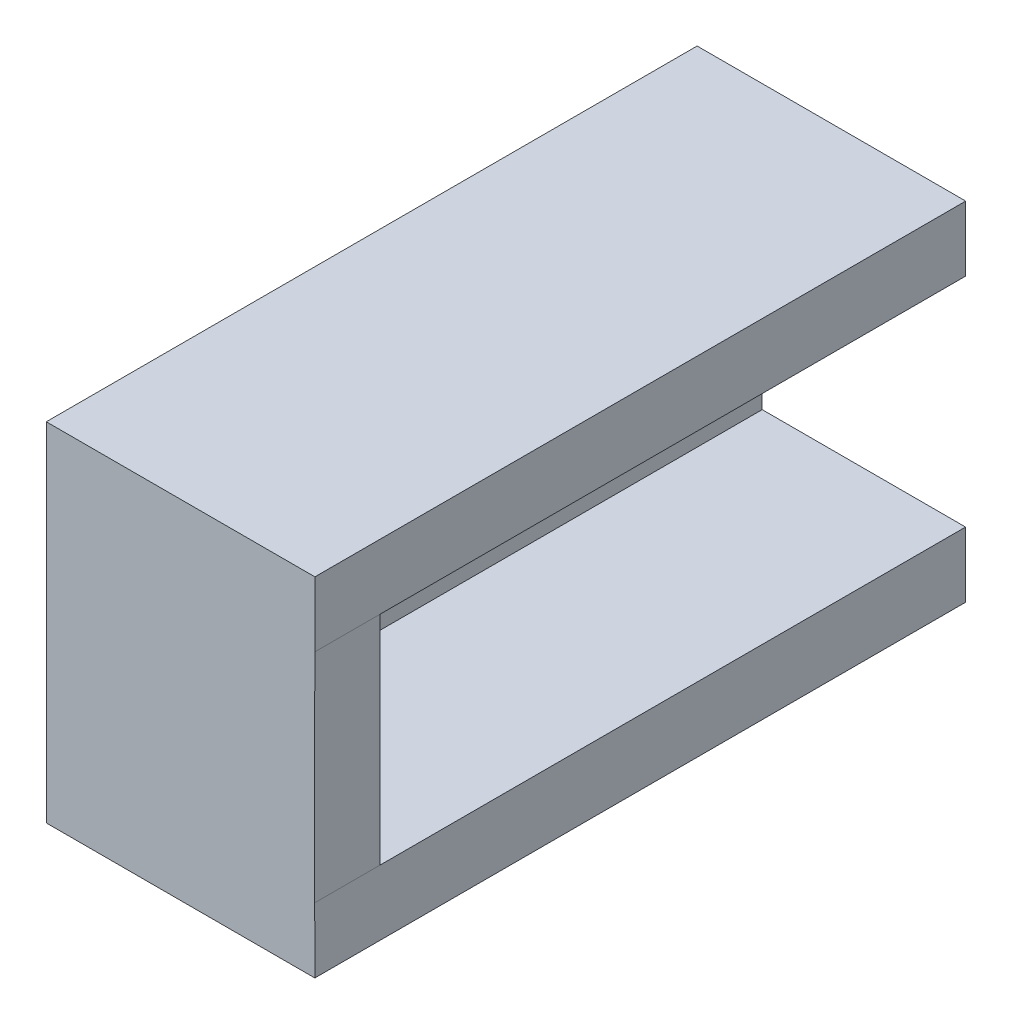
ISO-10303-21;
HEADER;
FILE_DESCRIPTION(('STEP AP214'),'2;1');
FILE_NAME('part.step','',(''),(''),'','','');
FILE_SCHEMA(('AUTOMOTIVE_DESIGN { 1 0 10303 214 1 1 1 1 }'));
ENDSEC;
DATA;
#1=APPLICATION_CONTEXT('core data for automotive mechanical design processes');
#2=APPLICATION_PROTOCOL_DEFINITION('international standard','automotive_design',2000,#1);
#3=PRODUCT_CONTEXT('',#1,'mechanical');
#4=PRODUCT('Part','Part','',(#3));
#5=PRODUCT_RELATED_PRODUCT_CATEGORY('part','',(#4));
#6=PRODUCT_DEFINITION_FORMATION('','',#4);
#7=PRODUCT_DEFINITION_CONTEXT('part definition',#1,'design');
#8=PRODUCT_DEFINITION('design','',#6,#7);
#9=PRODUCT_DEFINITION_SHAPE('','',#8);
#10=(LENGTH_UNIT() NAMED_UNIT(*) SI_UNIT(.MILLI.,.METRE.));
#11=(NAMED_UNIT(*) PLANE_ANGLE_UNIT() SI_UNIT($,.RADIAN.));
#12=(NAMED_UNIT(*) SI_UNIT($,.STERADIAN.) SOLID_ANGLE_UNIT());
#13=UNCERTAINTY_MEASURE_WITH_UNIT(LENGTH_MEASURE(1.E-05),#10,'distance_accuracy_value','');
#14=(GEOMETRIC_REPRESENTATION_CONTEXT(3) GLOBAL_UNCERTAINTY_ASSIGNED_CONTEXT((#13)) GLOBAL_UNIT_ASSIGNED_CONTEXT((#10,
#11,#12)) REPRESENTATION_CONTEXT('',''));
#15=CARTESIAN_POINT('',(0.,0.,0.));
#16=DIRECTION('',(0.,0.,1.));
#17=DIRECTION('',(1.,0.,0.));
#18=AXIS2_PLACEMENT_3D('',#15,#16,#17);
#19=CARTESIAN_POINT('',(0.,-90.9796047629119,-228.6));
#20=DIRECTION('',(0.,1.,0.));
#21=DIRECTION('',(0.,0.,1.));
#22=AXIS2_PLACEMENT_3D('',#19,#20,#21);
#23=PLANE('',#22);
#24=DIRECTION('',(-1.,0.,0.));
#25=VECTOR('',#24,1.);
#26=CARTESIAN_POINT('',(0.,-90.9796047629119,0.));
#27=LINE('',#26,#25);
#28=CARTESIAN_POINT('',(-1393.79066229486,-90.9796047629119,0.));
#29=VERTEX_POINT('',#28);
#30=CARTESIAN_POINT('',(-1473.16566229486,-90.9796047629119,0.));
#31=VERTEX_POINT('',#30);
#32=EDGE_CURVE('E67',#29,#31,#27,.T.);
#33=ORIENTED_EDGE('',*,*,#32,.T.);
#34=DIRECTION('',(0.,0.,1.));
#35=VECTOR('',#34,1.);
#36=CARTESIAN_POINT('',(-1473.16566229486,-90.9796047629119,-228.6));
#37=LINE('',#36,#35);
#38=CARTESIAN_POINT('',(-1473.16566229486,-90.9796047629119,-228.6));
#39=VERTEX_POINT('',#38);
#40=EDGE_CURVE('E181',#39,#31,#37,.T.);
#41=ORIENTED_EDGE('',*,*,#40,.F.);
#42=DIRECTION('',(-1.,0.,0.));
#43=VECTOR('',#42,1.);
#44=CARTESIAN_POINT('',(0.,-90.9796047629119,-228.6));
#45=LINE('',#44,#43);
#46=CARTESIAN_POINT('',(-1393.79066229486,-90.9796047629119,-228.6));
#47=VERTEX_POINT('',#46);
#48=EDGE_CURVE('E171',#47,#39,#45,.T.);
#49=ORIENTED_EDGE('',*,*,#48,.F.);
#50=DIRECTION('',(0.,0.,1.));
#51=VECTOR('',#50,1.);
#52=CARTESIAN_POINT('',(-1393.79066229486,-90.9796047629119,-228.6));
#53=LINE('',#52,#51);
#54=EDGE_CURVE('E179',#47,#29,#53,.T.);
#55=ORIENTED_EDGE('',*,*,#54,.T.);
#56=EDGE_LOOP('',(#33,#41,#49,#55));
#57=FACE_BOUND('',#56,.T.);
#58=ADVANCED_FACE('F43',(#57),#23,.F.);
#59=CARTESIAN_POINT('',(-1473.16566229486,0.,-228.6));
#60=DIRECTION('',(-1.,0.,0.));
#61=DIRECTION('',(0.,0.,1.));
#62=AXIS2_PLACEMENT_3D('',#59,#60,#61);
#63=PLANE('',#62);
#64=DIRECTION('',(0.,-1.,0.));
#65=VECTOR('',#64,1.);
#66=CARTESIAN_POINT('',(-1473.16566229486,0.,0.));
#67=LINE('',#66,#65);
#68=CARTESIAN_POINT('',(-1473.16566229486,-175.779604762912,0.));
#69=VERTEX_POINT('',#68);
#70=EDGE_CURVE('E145',#31,#69,#67,.T.);
#71=ORIENTED_EDGE('',*,*,#70,.T.);
#72=DIRECTION('',(0.,0.,1.));
#73=VECTOR('',#72,1.);
#74=CARTESIAN_POINT('',(-1473.16566229486,-175.779604762912,-228.6));
#75=LINE('',#74,#73);
#76=CARTESIAN_POINT('',(-1473.16566229486,-175.779604762912,-228.6));
#77=VERTEX_POINT('',#76);
#78=EDGE_CURVE('E183',#77,#69,#75,.T.);
#79=ORIENTED_EDGE('',*,*,#78,.F.);
#80=DIRECTION('',(0.,-1.,0.));
#81=VECTOR('',#80,1.);
#82=CARTESIAN_POINT('',(-1473.16566229486,0.,-228.6));
#83=LINE('',#82,#81);
#84=EDGE_CURVE('E169',#39,#77,#83,.T.);
#85=ORIENTED_EDGE('',*,*,#84,.F.);
#86=ORIENTED_EDGE('',*,*,#40,.T.);
#87=EDGE_LOOP('',(#71,#79,#85,#86));
#88=FACE_BOUND('',#87,.T.);
#89=ADVANCED_FACE('F207',(#88),#63,.F.);
#90=CARTESIAN_POINT('',(0.,-175.779604762912,-228.6));
#91=DIRECTION('',(0.,-1.,0.));
#92=DIRECTION('',(0.,0.,-1.));
#93=AXIS2_PLACEMENT_3D('',#90,#91,#92);
#94=PLANE('',#93);
#95=DIRECTION('',(1.,0.,0.));
#96=VECTOR('',#95,1.);
#97=CARTESIAN_POINT('',(0.,-175.779604762912,0.));
#98=LINE('',#97,#96);
#99=CARTESIAN_POINT('',(-1393.80082229486,-175.779604762912,0.));
#100=VERTEX_POINT('',#99);
#101=EDGE_CURVE('E143',#69,#100,#98,.T.);
#102=ORIENTED_EDGE('',*,*,#101,.T.);
#103=DIRECTION('',(0.,0.,1.));
#104=VECTOR('',#103,1.);
#105=CARTESIAN_POINT('',(-1393.80082229486,-175.779604762912,-228.6));
#106=LINE('',#105,#104);
#107=CARTESIAN_POINT('',(-1393.80082229486,-175.779604762912,-228.6));
#108=VERTEX_POINT('',#107);
#109=EDGE_CURVE('E137',#108,#100,#106,.T.);
#110=ORIENTED_EDGE('',*,*,#109,.F.);
#111=DIRECTION('',(1.,0.,0.));
#112=VECTOR('',#111,1.);
#113=CARTESIAN_POINT('',(0.,-175.779604762912,-228.6));
#114=LINE('',#113,#112);
#115=EDGE_CURVE('E167',#77,#108,#114,.T.);
#116=ORIENTED_EDGE('',*,*,#115,.F.);
#117=ORIENTED_EDGE('',*,*,#78,.T.);
#118=EDGE_LOOP('',(#102,#110,#116,#117));
#119=FACE_BOUND('',#118,.T.);
#120=ADVANCED_FACE('F212',(#119),#94,.F.);
#121=CARTESIAN_POINT('',(-1498.56566229486,0.,-228.6));
#122=DIRECTION('',(-1.,0.,0.));
#123=DIRECTION('',(0.,0.,1.));
#124=AXIS2_PLACEMENT_3D('',#121,#122,#123);
#125=PLANE('',#124);
#126=DIRECTION('',(0.,0.,1.));
#127=VECTOR('',#126,1.);
#128=CARTESIAN_POINT('',(-1498.56566229486,-201.179604762912,-228.6));
#129=LINE('',#128,#127);
#130=CARTESIAN_POINT('',(-1498.56566229486,-201.179604762912,-228.6));
#131=VERTEX_POINT('',#130);
#132=CARTESIAN_POINT('',(-1498.56566229486,-201.179604762912,25.4));
#133=VERTEX_POINT('',#132);
#134=EDGE_CURVE('E47',#131,#133,#129,.T.);
#135=ORIENTED_EDGE('',*,*,#134,.T.);
#136=DIRECTION('',(0.,-1.,0.));
#137=VECTOR('',#136,1.);
#138=CARTESIAN_POINT('',(-1498.56566229486,0.,25.4));
#139=LINE('',#138,#137);
#140=CARTESIAN_POINT('',(-1498.56566229486,-65.5796047629119,25.4));
#141=VERTEX_POINT('',#140);
#142=EDGE_CURVE('E153',#141,#133,#139,.T.);
#143=ORIENTED_EDGE('',*,*,#142,.F.);
#144=DIRECTION('',(0.,0.,1.));
#145=VECTOR('',#144,1.);
#146=CARTESIAN_POINT('',(-1498.56566229486,-65.5796047629119,-228.6));
#147=LINE('',#146,#145);
#148=CARTESIAN_POINT('',(-1498.56566229486,-65.5796047629119,-228.6));
#149=VERTEX_POINT('',#148);
#150=EDGE_CURVE('E11',#149,#141,#147,.T.);
#151=ORIENTED_EDGE('',*,*,#150,.F.);
#152=DIRECTION('',(0.,-1.,0.));
#153=VECTOR('',#152,1.);
#154=CARTESIAN_POINT('',(-1498.56566229486,0.,-228.6));
#155=LINE('',#154,#153);
#156=EDGE_CURVE('E160',#149,#131,#155,.T.);
#157=ORIENTED_EDGE('',*,*,#156,.T.);
#158=EDGE_LOOP('',(#135,#143,#151,#157));
#159=FACE_BOUND('',#158,.T.);
#160=ADVANCED_FACE('F45',(#159),#125,.T.);
#161=CARTESIAN_POINT('',(0.,-65.5796047629119,-228.6));
#162=DIRECTION('',(0.,1.,0.));
#163=DIRECTION('',(0.,0.,1.));
#164=AXIS2_PLACEMENT_3D('',#161,#162,#163);
#165=PLANE('',#164);
#166=ORIENTED_EDGE('',*,*,#150,.T.);
#167=DIRECTION('',(-1.,0.,0.));
#168=VECTOR('',#167,1.);
#169=CARTESIAN_POINT('',(0.,-65.5796047629119,25.4));
#170=LINE('',#169,#168);
#171=CARTESIAN_POINT('',(-1393.74098229486,-65.5796047629119,25.4));
#172=VERTEX_POINT('',#171);
#173=EDGE_CURVE('E157',#172,#141,#170,.T.);
#174=ORIENTED_EDGE('',*,*,#173,.F.);
#175=DIRECTION('',(0.,0.,1.));
#176=VECTOR('',#175,1.);
#177=CARTESIAN_POINT('',(-1393.74098229486,-65.5796047629119,-228.6));
#178=LINE('',#177,#176);
#179=CARTESIAN_POINT('',(-1393.74098229486,-65.5796047629119,-228.6));
#180=VERTEX_POINT('',#179);
#181=EDGE_CURVE('E52',#180,#172,#178,.T.);
#182=ORIENTED_EDGE('',*,*,#181,.F.);
#183=DIRECTION('',(-1.,0.,0.));
#184=VECTOR('',#183,1.);
#185=CARTESIAN_POINT('',(0.,-65.5796047629119,-228.6));
#186=LINE('',#185,#184);
#187=EDGE_CURVE('E175',#180,#149,#186,.T.);
#188=ORIENTED_EDGE('',*,*,#187,.T.);
#189=EDGE_LOOP('',(#166,#174,#182,#188));
#190=FACE_BOUND('',#189,.T.);
#191=ADVANCED_FACE('F224',(#190),#165,.T.);
#192=CARTESIAN_POINT('',(-1393.6073834469,2.72576436258718,-228.6));
#193=DIRECTION('',(-0.999998087222302,0.00195590177060063,0.));
#194=DIRECTION('',(-0.00195590177060063,-0.999998087222303,0.));
#195=AXIS2_PLACEMENT_3D('',#192,#193,#194);
#196=PLANE('',#195);
#197=ORIENTED_EDGE('',*,*,#181,.T.);
#198=DIRECTION('',(-0.00195590177060063,-0.999998087222303,0.));
#199=VECTOR('',#198,1.);
#200=CARTESIAN_POINT('',(-1393.6073834469,2.72576436258718,25.4));
#201=LINE('',#200,#199);
#202=CARTESIAN_POINT('',(-1393.79066229486,-90.9796047629119,25.4));
#203=VERTEX_POINT('',#202);
#204=EDGE_CURVE('E129',#172,#203,#201,.T.);
#205=ORIENTED_EDGE('',*,*,#204,.T.);
#206=DIRECTION('',(0.,0.,-1.));
#207=VECTOR('',#206,1.);
#208=CARTESIAN_POINT('',(-1393.79066229486,-90.9796047629119,25.4));
#209=LINE('',#208,#207);
#210=EDGE_CURVE('E60',#203,#29,#209,.T.);
#211=ORIENTED_EDGE('',*,*,#210,.T.);
#212=ORIENTED_EDGE('',*,*,#54,.F.);
#213=DIRECTION('',(-0.00195590177060063,-0.999998087222303,0.));
#214=VECTOR('',#213,1.);
#215=CARTESIAN_POINT('',(-1393.6073834469,2.72576436258718,-228.6));
#216=LINE('',#215,#214);
#217=EDGE_CURVE('E173',#180,#47,#216,.T.);
#218=ORIENTED_EDGE('',*,*,#217,.F.);
#219=EDGE_LOOP('',(#197,#205,#211,#212,#218));
#220=FACE_BOUND('',#219,.T.);
#221=ADVANCED_FACE('F204',(#220),#196,.F.);
#222=CARTESIAN_POINT('',(-1394.04039134619,-1.92092179909948,-228.6));
#223=DIRECTION('',(-0.999999050624453,-0.00137795144771115,0.));
#224=DIRECTION('',(0.00137795144771115,-0.999999050624453,0.));
#225=AXIS2_PLACEMENT_3D('',#222,#223,#224);
#226=PLANE('',#225);
#227=ORIENTED_EDGE('',*,*,#109,.T.);
#228=DIRECTION('',(0.,0.,-1.));
#229=VECTOR('',#228,1.);
#230=CARTESIAN_POINT('',(-1393.80082229486,-175.779604762912,25.4));
#231=LINE('',#230,#229);
#232=CARTESIAN_POINT('',(-1393.80082229486,-175.779604762912,25.4));
#233=VERTEX_POINT('',#232);
#234=EDGE_CURVE('E133',#233,#100,#231,.T.);
#235=ORIENTED_EDGE('',*,*,#234,.F.);
#236=DIRECTION('',(0.00137795144771115,-0.999999050624453,0.));
#237=VECTOR('',#236,1.);
#238=CARTESIAN_POINT('',(-1394.04039134619,-1.92092179909948,25.4));
#239=LINE('',#238,#237);
#240=CARTESIAN_POINT('',(-1393.76582229486,-201.179604762912,25.4));
#241=VERTEX_POINT('',#240);
#242=EDGE_CURVE('E118',#233,#241,#239,.T.);
#243=ORIENTED_EDGE('',*,*,#242,.T.);
#244=DIRECTION('',(0.,0.,1.));
#245=VECTOR('',#244,1.);
#246=CARTESIAN_POINT('',(-1393.76582229486,-201.179604762912,-228.6));
#247=LINE('',#246,#245);
#248=CARTESIAN_POINT('',(-1393.76582229486,-201.179604762912,-228.6));
#249=VERTEX_POINT('',#248);
#250=EDGE_CURVE('E186',#249,#241,#247,.T.);
#251=ORIENTED_EDGE('',*,*,#250,.F.);
#252=DIRECTION('',(0.00137795144771115,-0.999999050624453,0.));
#253=VECTOR('',#252,1.);
#254=CARTESIAN_POINT('',(-1394.04039134619,-1.92092179909948,-228.6));
#255=LINE('',#254,#253);
#256=EDGE_CURVE('E165',#108,#249,#255,.T.);
#257=ORIENTED_EDGE('',*,*,#256,.F.);
#258=EDGE_LOOP('',(#227,#235,#243,#251,#257));
#259=FACE_BOUND('',#258,.T.);
#260=ADVANCED_FACE('F134',(#259),#226,.F.);
#261=CARTESIAN_POINT('',(0.,-201.179604762912,-228.6));
#262=DIRECTION('',(0.,1.,0.));
#263=DIRECTION('',(-1.,0.,0.));
#264=AXIS2_PLACEMENT_3D('',#261,#262,#263);
#265=PLANE('',#264);
#266=ORIENTED_EDGE('',*,*,#250,.T.);
#267=DIRECTION('',(-1.,0.,0.));
#268=VECTOR('',#267,1.);
#269=CARTESIAN_POINT('',(0.,-201.179604762912,25.4));
#270=LINE('',#269,#268);
#271=EDGE_CURVE('E126',#241,#133,#270,.T.);
#272=ORIENTED_EDGE('',*,*,#271,.T.);
#273=ORIENTED_EDGE('',*,*,#134,.F.);
#274=DIRECTION('',(-1.,0.,0.));
#275=VECTOR('',#274,1.);
#276=CARTESIAN_POINT('',(0.,-201.179604762912,-228.6));
#277=LINE('',#276,#275);
#278=EDGE_CURVE('E163',#249,#131,#277,.T.);
#279=ORIENTED_EDGE('',*,*,#278,.F.);
#280=EDGE_LOOP('',(#266,#272,#273,#279));
#281=FACE_BOUND('',#280,.T.);
#282=ADVANCED_FACE('F194',(#281),#265,.F.);
#283=CARTESIAN_POINT('',(0.,0.,-228.6));
#284=DIRECTION('',(0.,0.,1.));
#285=DIRECTION('',(1.,0.,0.));
#286=AXIS2_PLACEMENT_3D('',#283,#284,#285);
#287=PLANE('',#286);
#288=ORIENTED_EDGE('',*,*,#156,.F.);
#289=ORIENTED_EDGE('',*,*,#187,.F.);
#290=ORIENTED_EDGE('',*,*,#217,.T.);
#291=ORIENTED_EDGE('',*,*,#48,.T.);
#292=ORIENTED_EDGE('',*,*,#84,.T.);
#293=ORIENTED_EDGE('',*,*,#115,.T.);
#294=ORIENTED_EDGE('',*,*,#256,.T.);
#295=ORIENTED_EDGE('',*,*,#278,.T.);
#296=EDGE_LOOP('',(#288,#289,#290,#291,#292,#293,#294,#295));
#297=FACE_BOUND('',#296,.T.);
#298=ADVANCED_FACE('F196',(#297),#287,.F.);
#299=CARTESIAN_POINT('',(0.,0.,25.4));
#300=DIRECTION('',(0.,0.,1.));
#301=DIRECTION('',(1.,0.,0.));
#302=AXIS2_PLACEMENT_3D('',#299,#300,#301);
#303=PLANE('',#302);
#304=ORIENTED_EDGE('',*,*,#142,.T.);
#305=ORIENTED_EDGE('',*,*,#271,.F.);
#306=ORIENTED_EDGE('',*,*,#242,.F.);
#307=DIRECTION('',(-0.000119811319894566,-0.999999992822624,0.));
#308=VECTOR('',#307,1.);
#309=CARTESIAN_POINT('',(-1393.77974190089,0.166990591718007,25.4));
#310=LINE('',#309,#308);
#311=EDGE_CURVE('E124',#203,#233,#310,.T.);
#312=ORIENTED_EDGE('',*,*,#311,.F.);
#313=ORIENTED_EDGE('',*,*,#204,.F.);
#314=ORIENTED_EDGE('',*,*,#173,.T.);
#315=EDGE_LOOP('',(#304,#305,#306,#312,#313,#314));
#316=FACE_BOUND('',#315,.T.);
#317=ADVANCED_FACE('F121',(#316),#303,.T.);
#318=CARTESIAN_POINT('',(-1393.77974190089,0.166990591718007,25.4));
#319=DIRECTION('',(0.999999992822624,-0.000119811319894566,0.));
#320=DIRECTION('',(0.000119811319894566,0.999999992822624,0.));
#321=AXIS2_PLACEMENT_3D('',#318,#319,#320);
#322=PLANE('',#321);
#323=DIRECTION('',(-0.000119811319894566,-0.999999992822624,0.));
#324=VECTOR('',#323,1.);
#325=CARTESIAN_POINT('',(-1393.77974190089,0.166990591718007,0.));
#326=LINE('',#325,#324);
#327=EDGE_CURVE('E148',#29,#100,#326,.T.);
#328=ORIENTED_EDGE('',*,*,#327,.F.);
#329=ORIENTED_EDGE('',*,*,#210,.F.);
#330=ORIENTED_EDGE('',*,*,#311,.T.);
#331=ORIENTED_EDGE('',*,*,#234,.T.);
#332=EDGE_LOOP('',(#328,#329,#330,#331));
#333=FACE_BOUND('',#332,.T.);
#334=ADVANCED_FACE('F142',(#333),#322,.T.);
#335=CARTESIAN_POINT('',(0.,0.,0.));
#336=DIRECTION('',(0.,0.,1.));
#337=DIRECTION('',(1.,0.,0.));
#338=AXIS2_PLACEMENT_3D('',#335,#336,#337);
#339=PLANE('',#338);
#340=ORIENTED_EDGE('',*,*,#327,.T.);
#341=ORIENTED_EDGE('',*,*,#101,.F.);
#342=ORIENTED_EDGE('',*,*,#70,.F.);
#343=ORIENTED_EDGE('',*,*,#32,.F.);
#344=EDGE_LOOP('',(#340,#341,#342,#343));
#345=FACE_BOUND('',#344,.T.);
#346=ADVANCED_FACE('F230',(#345),#339,.F.);
#347=CLOSED_SHELL('',(#58,#89,#120,#160,#191,#221,#260,#282,#298,#317,#334,#346));
#348=MANIFOLD_SOLID_BREP('B2',#347);
#349=ADVANCED_BREP_SHAPE_REPRESENTATION('',(#18,#348),#14);
#350=SHAPE_DEFINITION_REPRESENTATION(#9,#349);
ENDSEC;
END-ISO-10303-21;
